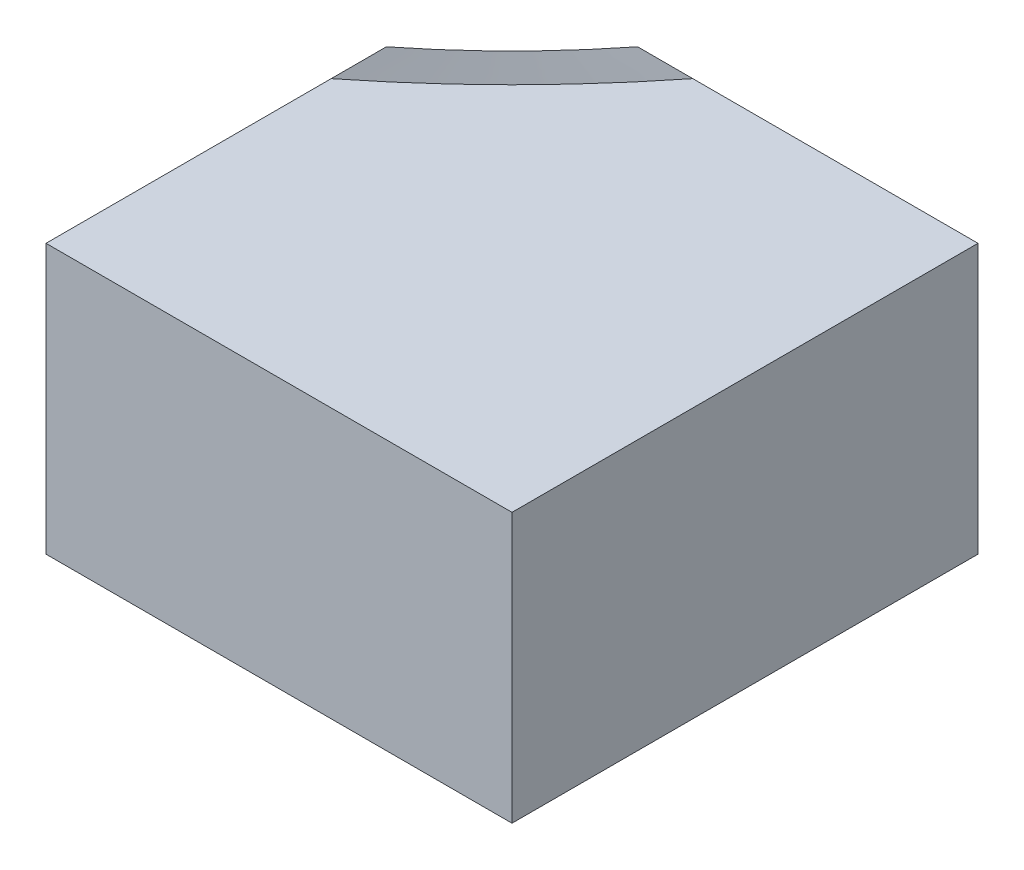
ISO-10303-21;
HEADER;
FILE_DESCRIPTION(('STEP AP214'),'2;1');
FILE_NAME('part.step','',(''),(''),'','','');
FILE_SCHEMA(('AUTOMOTIVE_DESIGN { 1 0 10303 214 1 1 1 1 }'));
ENDSEC;
DATA;
#1=APPLICATION_CONTEXT('core data for automotive mechanical design processes');
#2=APPLICATION_PROTOCOL_DEFINITION('international standard','automotive_design',2000,#1);
#3=PRODUCT_CONTEXT('',#1,'mechanical');
#4=PRODUCT('Part','Part','',(#3));
#5=PRODUCT_RELATED_PRODUCT_CATEGORY('part','',(#4));
#6=PRODUCT_DEFINITION_FORMATION('','',#4);
#7=PRODUCT_DEFINITION_CONTEXT('part definition',#1,'design');
#8=PRODUCT_DEFINITION('design','',#6,#7);
#9=PRODUCT_DEFINITION_SHAPE('','',#8);
#10=(LENGTH_UNIT() NAMED_UNIT(*) SI_UNIT(.MILLI.,.METRE.));
#11=(NAMED_UNIT(*) PLANE_ANGLE_UNIT() SI_UNIT($,.RADIAN.));
#12=(NAMED_UNIT(*) SI_UNIT($,.STERADIAN.) SOLID_ANGLE_UNIT());
#13=UNCERTAINTY_MEASURE_WITH_UNIT(LENGTH_MEASURE(1.E-05),#10,'distance_accuracy_value','');
#14=(GEOMETRIC_REPRESENTATION_CONTEXT(3) GLOBAL_UNCERTAINTY_ASSIGNED_CONTEXT((#13)) GLOBAL_UNIT_ASSIGNED_CONTEXT((#10,
#11,#12)) REPRESENTATION_CONTEXT('',''));
#15=CARTESIAN_POINT('',(0.,0.,0.));
#16=DIRECTION('',(0.,0.,1.));
#17=DIRECTION('',(1.,0.,0.));
#18=AXIS2_PLACEMENT_3D('',#15,#16,#17);
#19=CARTESIAN_POINT('',(32.4999999999999,19.5000000000001,0.));
#20=DIRECTION('',(0.,-1.,0.));
#21=DIRECTION('',(0.,0.,-1.));
#22=AXIS2_PLACEMENT_3D('',#19,#20,#21);
#23=PLANE('',#22);
#24=DIRECTION('',(0.,0.,-1.));
#25=VECTOR('',#24,1.);
#26=CARTESIAN_POINT('',(33.,19.5000000000001,-33.));
#27=LINE('',#26,#25);
#28=CARTESIAN_POINT('',(33.,19.5000000000001,33.));
#29=VERTEX_POINT('',#28);
#30=CARTESIAN_POINT('',(33.,19.5,19.5000000000001));
#31=VERTEX_POINT('',#30);
#32=EDGE_CURVE('E185',#29,#31,#27,.T.);
#33=ORIENTED_EDGE('',*,*,#32,.T.);
#34=DIRECTION('',(1.,0.,0.));
#35=VECTOR('',#34,1.);
#36=CARTESIAN_POINT('',(32.4999999999999,19.5000000000001,19.5000000000001));
#37=LINE('',#36,#35);
#38=CARTESIAN_POINT('',(24.7386337537058,19.5,19.5000000000001));
#39=VERTEX_POINT('',#38);
#40=EDGE_CURVE('E96',#39,#31,#37,.T.);
#41=ORIENTED_EDGE('',*,*,#40,.F.);
#42=CARTESIAN_POINT('',(0.,19.5,0.));
#43=DIRECTION('',(0.,-1.,0.));
#44=DIRECTION('',(0.,0.,-1.));
#45=AXIS2_PLACEMENT_3D('',#42,#43,#44);
#46=CIRCLE('',#45,31.4999999999999);
#47=CARTESIAN_POINT('',(19.5,19.5,24.7386337537059));
#48=VERTEX_POINT('',#47);
#49=EDGE_CURVE('E45',#39,#48,#46,.T.);
#50=ORIENTED_EDGE('',*,*,#49,.T.);
#51=DIRECTION('',(0.,0.,-1.));
#52=VECTOR('',#51,1.);
#53=CARTESIAN_POINT('',(19.5,19.5000000000001,0.));
#54=LINE('',#53,#52);
#55=CARTESIAN_POINT('',(19.5,19.5000000000001,33.));
#56=VERTEX_POINT('',#55);
#57=EDGE_CURVE('E254',#56,#48,#54,.T.);
#58=ORIENTED_EDGE('',*,*,#57,.F.);
#59=DIRECTION('',(-1.,0.,0.));
#60=VECTOR('',#59,1.);
#61=CARTESIAN_POINT('',(0.,19.5000000000001,33.));
#62=LINE('',#61,#60);
#63=EDGE_CURVE('E189',#29,#56,#62,.T.);
#64=ORIENTED_EDGE('',*,*,#63,.F.);
#65=EDGE_LOOP('',(#33,#41,#50,#58,#64));
#66=FACE_BOUND('',#65,.T.);
#67=ADVANCED_FACE('F41',(#66),#23,.F.);
#68=CARTESIAN_POINT('',(0.,13.5486364278669,0.));
#69=DIRECTION('',(0.,1.,0.));
#70=DIRECTION('',(0.,0.,1.));
#71=AXIS2_PLACEMENT_3D('',#68,#69,#70);
#72=CONICAL_SURFACE('',#71,21.8862588450156,1.01648883059334);
#73=ORIENTED_EDGE('',*,*,#49,.F.);
#74=DIRECTION('',(0.667758668490539,0.526354614616297,0.526354614616299));
#75=VECTOR('',#74,1.);
#76=CARTESIAN_POINT('',(0.,0.,0.));
#77=LINE('',#76,#75);
#78=CARTESIAN_POINT('',(17.188448946211,13.5486364278669,13.5486364278669));
#79=VERTEX_POINT('',#78);
#80=EDGE_CURVE('E91',#79,#39,#77,.T.);
#81=ORIENTED_EDGE('',*,*,#80,.F.);
#82=CARTESIAN_POINT('',(0.,13.5486364278669,0.));
#83=DIRECTION('',(0.,-1.,0.));
#84=DIRECTION('',(0.,0.,-1.));
#85=AXIS2_PLACEMENT_3D('',#82,#83,#84);
#86=CIRCLE('',#85,21.8862588450156);
#87=CARTESIAN_POINT('',(13.5486364278668,13.5486364278669,17.188448946211));
#88=VERTEX_POINT('',#87);
#89=EDGE_CURVE('E300',#79,#88,#86,.T.);
#90=ORIENTED_EDGE('',*,*,#89,.T.);
#91=DIRECTION('',(0.526354614616295,0.526354614616297,0.667758668490542));
#92=VECTOR('',#91,1.);
#93=CARTESIAN_POINT('',(0.,0.,0.));
#94=LINE('',#93,#92);
#95=EDGE_CURVE('E60',#48,#88,#94,.F.);
#96=ORIENTED_EDGE('',*,*,#95,.F.);
#97=EDGE_LOOP('',(#73,#81,#90,#96));
#98=FACE_BOUND('',#97,.T.);
#99=ADVANCED_FACE('F174',(#98),#72,.F.);
#100=CARTESIAN_POINT('',(0.,0.,0.));
#101=DIRECTION('',(0.,-1.,0.));
#102=DIRECTION('',(1.,0.,0.));
#103=AXIS2_PLACEMENT_3D('',#100,#101,#102);
#104=SPHERICAL_SURFACE('',#103,25.7405103928719);
#105=ORIENTED_EDGE('',*,*,#89,.F.);
#106=CARTESIAN_POINT('',(0.,0.,13.5486364278669));
#107=DIRECTION('',(0.,0.,-1.));
#108=DIRECTION('',(0.,1.,0.));
#109=AXIS2_PLACEMENT_3D('',#106,#107,#108);
#110=CIRCLE('',#109,21.8862588450156);
#111=CARTESIAN_POINT('',(21.7586001723716,2.36043317420627,13.5486364278669));
#112=VERTEX_POINT('',#111);
#113=EDGE_CURVE('E106',#79,#112,#110,.T.);
#114=ORIENTED_EDGE('',*,*,#113,.T.);
#115=CARTESIAN_POINT('',(0.,2.36043317420627,0.));
#116=DIRECTION('',(0.,-1.,0.));
#117=DIRECTION('',(0.,0.,-1.));
#118=AXIS2_PLACEMENT_3D('',#115,#116,#117);
#119=CIRCLE('',#118,25.6320547462674);
#120=CARTESIAN_POINT('',(13.5486364278669,2.36043317420627,21.7586001723716));
#121=VERTEX_POINT('',#120);
#122=EDGE_CURVE('E146',#112,#121,#119,.T.);
#123=ORIENTED_EDGE('',*,*,#122,.T.);
#124=CARTESIAN_POINT('',(13.5486364278669,0.,0.));
#125=DIRECTION('',(1.,0.,0.));
#126=DIRECTION('',(0.,0.,-1.));
#127=AXIS2_PLACEMENT_3D('',#124,#125,#126);
#128=CIRCLE('',#127,21.8862588450156);
#129=EDGE_CURVE('E258',#88,#121,#128,.T.);
#130=ORIENTED_EDGE('',*,*,#129,.F.);
#131=EDGE_LOOP('',(#105,#114,#123,#130));
#132=FACE_BOUND('',#131,.T.);
#133=ADVANCED_FACE('F155',(#132),#104,.F.);
#134=CARTESIAN_POINT('',(27.6399036193533,2.36043317420627,0.));
#135=DIRECTION('',(0.,-1.,0.));
#136=DIRECTION('',(0.,0.,-1.));
#137=AXIS2_PLACEMENT_3D('',#134,#135,#136);
#138=PLANE('',#137);
#139=CARTESIAN_POINT('',(0.,2.36043317420627,0.));
#140=DIRECTION('',(0.,-1.,0.));
#141=DIRECTION('',(0.,0.,-1.));
#142=AXIS2_PLACEMENT_3D('',#139,#140,#141);
#143=CIRCLE('',#142,27.6399036193533);
#144=CARTESIAN_POINT('',(23.4683824983538,2.36043317420627,14.6013456570995));
#145=VERTEX_POINT('',#144);
#146=CARTESIAN_POINT('',(14.6013456570994,2.36043317420627,23.4683824983539));
#147=VERTEX_POINT('',#146);
#148=EDGE_CURVE('E203',#145,#147,#143,.T.);
#149=ORIENTED_EDGE('',*,*,#148,.T.);
#150=CARTESIAN_POINT('',(24.5993379804337,2.36043317420627,39.6672243534467));
#151=CARTESIAN_POINT('',(23.7135950293793,2.36043317420627,38.2338527694047));
#152=CARTESIAN_POINT('',(22.8279537319469,2.36043317420627,36.8004183129105));
#153=CARTESIAN_POINT('',(21.0570270708889,2.36043317420627,33.9333410794372));
#154=CARTESIAN_POINT('',(20.1717417052222,2.36043317420627,32.4996983037187));
#155=CARTESIAN_POINT('',(18.4016864972902,2.36043317420627,29.6321331625707));
#156=CARTESIAN_POINT('',(17.5169166453003,2.36043317420627,28.1982108031442));
#157=CARTESIAN_POINT('',(15.7481433348418,2.36043317420627,25.3298820901043));
#158=CARTESIAN_POINT('',(14.8641398807546,2.36043317420627,23.8954757337882));
#159=CARTESIAN_POINT('',(13.5391009545038,2.36043317420627,21.7432329454314));
#160=CARTESIAN_POINT('',(13.097573813547,2.36043317420627,21.0256992382864));
#161=CARTESIAN_POINT('',(12.2149691447458,2.36043317420627,19.5903568905841));
#162=CARTESIAN_POINT('',(11.7738916161883,2.36043317420627,18.8725482504653));
#163=CARTESIAN_POINT('',(10.8923655493752,2.36043317420627,17.4365603833588));
#164=CARTESIAN_POINT('',(10.4519170012715,2.36043317420627,16.7183811624184));
#165=CARTESIAN_POINT('',(9.57192167167061,2.36043317420627,15.2814647080534));
#166=CARTESIAN_POINT('',(9.13237489535332,2.36043317420627,14.5627274714561));
#167=CARTESIAN_POINT('',(8.25462626435377,2.36043317420627,13.1243780284814));
#168=CARTESIAN_POINT('',(7.81642448362479,2.36043317420627,12.4047657769252));
#169=CARTESIAN_POINT('',(7.16082863751445,2.36043317420627,11.324320116887));
#170=CARTESIAN_POINT('',(6.94258306131177,2.36043317420627,10.9640035061726));
#171=CARTESIAN_POINT('',(6.50685386593697,2.36043317420627,10.2429077123471));
#172=CARTESIAN_POINT('',(6.28937024968975,2.36043317420627,9.88212852746746));
#173=CARTESIAN_POINT('',(5.85542639213522,2.36043317420627,9.15992114659262));
#174=CARTESIAN_POINT('',(5.63896622231247,2.36043317420627,8.79849290762643));
#175=CARTESIAN_POINT('',(5.20750945525894,2.36043317420627,8.07476758220636));
#176=CARTESIAN_POINT('',(4.99251284256307,2.36043317420627,7.71247050498816));
#177=CARTESIAN_POINT('',(4.67163972631961,2.36043317420627,7.16805323406913));
#178=CARTESIAN_POINT('',(4.56494895683102,2.36043317420627,6.9864130804957));
#179=CARTESIAN_POINT('',(4.35224866349939,2.36043317420627,6.62273508813042));
#180=CARTESIAN_POINT('',(4.24623913705494,2.36043317420627,6.44069725086074));
#181=CARTESIAN_POINT('',(4.0350665234058,2.36043317420627,6.07612184439681));
#182=CARTESIAN_POINT('',(3.92990346663647,2.36043317420627,5.89358425754721));
#183=CARTESIAN_POINT('',(3.72068878746636,2.36043317420627,5.52787040737645));
#184=CARTESIAN_POINT('',(3.61663717976186,2.36043317420627,5.34469413565259));
#185=CARTESIAN_POINT('',(3.51327326796035,2.36043317420627,5.1611282121176));
#186=B_SPLINE_CURVE_WITH_KNOTS('',3,(#150,#151,#152,#153,#154,#155,#156,#157,#158,#159,#160,
#161,#162,#163,#164,#165,#166,#167,#168,#169,#170,#171,#172,#173,#174,#175,#176,#177,#178,#179,
#180,#181,#182,#183,#184,#185),.UNSPECIFIED.,.F.,.F.,(4,2,2,2,2,2,2,2,2,2,2,2,2,2,2,2,2,4),(0.,
5.05488405272402,10.109738694061,15.1644946772692,20.2192793700094,22.7467696141236,
25.2742558429551,27.8017020545297,30.3291627437276,32.8567599989275,34.1205365165781,
35.384317880162,36.6481862482286,37.9120412404829,38.5440089019537,39.1759741487419,
39.8079620176437,40.4399582327647),.UNSPECIFIED.);
#187=EDGE_CURVE('E228',#147,#121,#186,.T.);
#188=ORIENTED_EDGE('',*,*,#187,.T.);
#189=ORIENTED_EDGE('',*,*,#122,.F.);
#190=CARTESIAN_POINT('',(10.8357215029913,2.36043317420627,6.86513776470053));
#191=CARTESIAN_POINT('',(11.2630925597176,2.36043317420627,7.12366176808169));
#192=CARTESIAN_POINT('',(11.6901776505371,2.36043317420627,7.38265757852894));
#193=CARTESIAN_POINT('',(12.5438979374666,2.36043317420627,7.90138867208216));
#194=CARTESIAN_POINT('',(12.970533134086,2.36043317420627,8.16112395434987));
#195=CARTESIAN_POINT('',(13.8234754515046,2.36043317420627,8.6811297137011));
#196=CARTESIAN_POINT('',(14.2497825732131,2.36043317420627,8.94140018929398));
#197=CARTESIAN_POINT('',(15.1021429610876,2.36043317420627,9.46235675172611));
#198=CARTESIAN_POINT('',(15.5281962271704,2.36043317420627,9.72304283870147));
#199=CARTESIAN_POINT('',(16.8060588971724,2.36043317420627,10.505579081987));
#200=CARTESIAN_POINT('',(17.6575743701329,2.36043317420627,11.0279091720098));
#201=CARTESIAN_POINT('',(19.360100704316,2.36043317420627,12.0733923954325));
#202=CARTESIAN_POINT('',(20.2111115650924,2.36043317420627,12.5965455295588));
#203=CARTESIAN_POINT('',(22.6408785628903,2.36043317420627,14.0913192450879));
#204=CARTESIAN_POINT('',(24.2192179304129,2.36043317420627,15.0636172109287));
#205=CARTESIAN_POINT('',(27.3752603205835,2.36043317420627,17.0092439052066));
#206=CARTESIAN_POINT('',(28.9529633434066,2.36043317420627,17.9825726333597));
#207=CARTESIAN_POINT('',(32.107987127397,2.36043317420627,19.9298678577189));
#208=CARTESIAN_POINT('',(33.685307886522,2.36043317420627,20.9038343572336));
#209=CARTESIAN_POINT('',(36.8396840067684,2.36043317420627,22.8521971478645));
#210=CARTESIAN_POINT('',(38.4167393678827,2.36043317420627,23.8265934389923));
#211=CARTESIAN_POINT('',(39.9937245464798,2.36043317420627,24.8011031541808));
#212=B_SPLINE_CURVE_WITH_KNOTS('',3,(#190,#191,#192,#193,#194,#195,#196,#197,#198,#199,#200,
#201,#202,#203,#204,#205,#206,#207,#208,#209,#210,#211),.UNSPECIFIED.,.F.,.F.,(4,2,2,2,2,2,2,2,
2,2,4),(0.,1.49844023879212,2.99687877961776,4.49531315259141,5.99374801635271,8.99060650672547,
11.9874676432788,17.5488214503847,23.1101737262181,28.671555086653,34.2329365965412),.UNSPECIFIED.);
#213=EDGE_CURVE('E137',#112,#145,#212,.T.);
#214=ORIENTED_EDGE('',*,*,#213,.T.);
#215=EDGE_LOOP('',(#149,#188,#189,#214));
#216=FACE_BOUND('',#215,.T.);
#217=ADVANCED_FACE('F149',(#216),#138,.T.);
#218=CARTESIAN_POINT('',(0.,0.,0.));
#219=DIRECTION('',(0.,-1.,0.));
#220=DIRECTION('',(1.,0.,0.));
#221=AXIS2_PLACEMENT_3D('',#218,#219,#220);
#222=SPHERICAL_SURFACE('',#221,27.7405103928719);
#223=CARTESIAN_POINT('',(0.,10.3743688599618,0.));
#224=DIRECTION('',(0.,-1.,0.));
#225=DIRECTION('',(0.,0.,-1.));
#226=AXIS2_PLACEMENT_3D('',#223,#224,#225);
#227=CIRCLE('',#226,25.7275802907014);
#228=CARTESIAN_POINT('',(21.1827546040733,10.3743688599618,14.6013456570995));
#229=VERTEX_POINT('',#228);
#230=CARTESIAN_POINT('',(14.6013456570994,10.3743688599618,21.1827546040733));
#231=VERTEX_POINT('',#230);
#232=EDGE_CURVE('E264',#229,#231,#227,.T.);
#233=ORIENTED_EDGE('',*,*,#232,.T.);
#234=CARTESIAN_POINT('',(14.6013456570995,0.,0.));
#235=DIRECTION('',(-1.,0.,0.));
#236=DIRECTION('',(0.,-1.,0.));
#237=AXIS2_PLACEMENT_3D('',#234,#235,#236);
#238=CIRCLE('',#237,23.5867891383913);
#239=EDGE_CURVE('E147',#231,#147,#238,.F.);
#240=ORIENTED_EDGE('',*,*,#239,.T.);
#241=ORIENTED_EDGE('',*,*,#148,.F.);
#242=CARTESIAN_POINT('',(0.,0.,14.6013456570995));
#243=DIRECTION('',(0.,0.,-1.));
#244=DIRECTION('',(0.,1.,0.));
#245=AXIS2_PLACEMENT_3D('',#242,#243,#244);
#246=CIRCLE('',#245,23.5867891383913);
#247=EDGE_CURVE('E204',#145,#229,#246,.F.);
#248=ORIENTED_EDGE('',*,*,#247,.T.);
#249=EDGE_LOOP('',(#233,#240,#241,#248));
#250=FACE_BOUND('',#249,.T.);
#251=ADVANCED_FACE('F154',(#250),#222,.T.);
#252=CARTESIAN_POINT('',(19.4999999999999,32.5,0.));
#253=DIRECTION('',(-1.,0.,0.));
#254=DIRECTION('',(0.,0.,-1.));
#255=AXIS2_PLACEMENT_3D('',#252,#253,#254);
#256=PLANE('',#255);
#257=DIRECTION('',(0.,0.,-1.));
#258=VECTOR('',#257,1.);
#259=CARTESIAN_POINT('',(19.5,11.7000000000001,0.));
#260=LINE('',#259,#258);
#261=CARTESIAN_POINT('',(19.5,11.7,33.));
#262=VERTEX_POINT('',#261);
#263=CARTESIAN_POINT('',(19.5,11.7000000000001,29.2465382566894));
#264=VERTEX_POINT('',#263);
#265=EDGE_CURVE('E114',#262,#264,#260,.T.);
#266=ORIENTED_EDGE('',*,*,#265,.F.);
#267=DIRECTION('',(0.,1.,0.));
#268=VECTOR('',#267,1.);
#269=CARTESIAN_POINT('',(19.5000000000001,0.,33.));
#270=LINE('',#269,#268);
#271=EDGE_CURVE('E194',#262,#56,#270,.T.);
#272=ORIENTED_EDGE('',*,*,#271,.T.);
#273=ORIENTED_EDGE('',*,*,#57,.T.);
#274=CARTESIAN_POINT('',(19.5,0.,0.));
#275=DIRECTION('',(1.,0.,0.));
#276=DIRECTION('',(0.,0.,-1.));
#277=AXIS2_PLACEMENT_3D('',#274,#275,#276);
#278=CIRCLE('',#277,31.4999999999999);
#279=EDGE_CURVE('E11',#48,#264,#278,.T.);
#280=ORIENTED_EDGE('',*,*,#279,.T.);
#281=EDGE_LOOP('',(#266,#272,#273,#280));
#282=FACE_BOUND('',#281,.T.);
#283=ADVANCED_FACE('F159',(#282),#256,.T.);
#284=CARTESIAN_POINT('',(32.5,11.7000000000001,0.));
#285=DIRECTION('',(0.,-1.,0.));
#286=DIRECTION('',(0.,0.,-1.));
#287=AXIS2_PLACEMENT_3D('',#284,#285,#286);
#288=PLANE('',#287);
#289=DIRECTION('',(0.,0.,-1.));
#290=VECTOR('',#289,1.);
#291=CARTESIAN_POINT('',(33.,11.7000000000001,-33.));
#292=LINE('',#291,#290);
#293=CARTESIAN_POINT('',(33.,11.7000000000001,33.));
#294=VERTEX_POINT('',#293);
#295=CARTESIAN_POINT('',(33.,11.7000000000001,19.5000000000001));
#296=VERTEX_POINT('',#295);
#297=EDGE_CURVE('E193',#294,#296,#292,.T.);
#298=ORIENTED_EDGE('',*,*,#297,.F.);
#299=DIRECTION('',(-1.,0.,0.));
#300=VECTOR('',#299,1.);
#301=CARTESIAN_POINT('',(0.,11.7000000000001,33.));
#302=LINE('',#301,#300);
#303=EDGE_CURVE('E226',#294,#262,#302,.T.);
#304=ORIENTED_EDGE('',*,*,#303,.T.);
#305=ORIENTED_EDGE('',*,*,#265,.T.);
#306=CARTESIAN_POINT('',(29.9831042332942,11.7000000000001,46.9998523165172));
#307=CARTESIAN_POINT('',(29.5695460419096,11.7000000000001,46.3114035057555));
#308=CARTESIAN_POINT('',(29.1563727624076,11.7000000000001,45.6227235286328));
#309=CARTESIAN_POINT('',(28.3309145968263,11.7000000000001,44.2448305512274));
#310=CARTESIAN_POINT('',(27.9186297115495,11.7000000000001,43.555617550464));
#311=CARTESIAN_POINT('',(26.6832428349779,11.7000000000001,41.4870015235794));
#312=CARTESIAN_POINT('',(25.8616526236678,11.7000000000001,40.1066946636882));
#313=CARTESIAN_POINT('',(24.2230959746683,11.7000000000001,37.3416252164109));
#314=CARTESIAN_POINT('',(23.4061344741696,11.7000000000001,35.9568597018244));
#315=CARTESIAN_POINT('',(21.7796223492399,11.7000000000001,33.1830492762636));
#316=CARTESIAN_POINT('',(20.970071426122,11.7000000000001,31.7940045408084));
#317=CARTESIAN_POINT('',(19.7705932500849,11.7000000000001,29.7178208854183));
#318=CARTESIAN_POINT('',(19.3766538702403,11.7000000000001,29.0330001316483));
#319=CARTESIAN_POINT('',(18.5918894504467,11.7000000000001,27.6615773365093));
#320=CARTESIAN_POINT('',(18.2010644029119,11.7000000000001,26.9749752994846));
#321=CARTESIAN_POINT('',(17.423168342795,11.7000000000001,25.5995290510725));
#322=CARTESIAN_POINT('',(17.036097821589,11.7000000000001,24.9106845615479));
#323=CARTESIAN_POINT('',(16.2666803040386,11.7000000000001,23.5303641361797));
#324=CARTESIAN_POINT('',(15.8843332831974,11.7000000000001,22.8388882140075));
#325=CARTESIAN_POINT('',(15.1254733333848,11.7000000000001,21.4524772962229));
#326=CARTESIAN_POINT('',(14.7489621260672,11.7000000000001,20.7575413568386));
#327=CARTESIAN_POINT('',(14.0035422153921,11.7000000000001,19.3635718196275));
#328=CARTESIAN_POINT('',(13.6346337030667,11.7000000000001,18.6645381194022));
#329=CARTESIAN_POINT('',(12.9068241377435,11.7000000000001,17.2614510623169));
#330=CARTESIAN_POINT('',(12.5479210327491,11.7000000000001,16.5573987724639));
#331=CARTESIAN_POINT('',(11.8433270003428,11.7000000000001,15.1427313714644));
#332=CARTESIAN_POINT('',(11.497635196273,11.7000000000001,14.4321166996746));
#333=CARTESIAN_POINT('',(10.9364574878759,11.7000000000001,13.240600979307));
#334=CARTESIAN_POINT('',(10.7159690889732,11.7000000000001,12.7620597933423));
#335=CARTESIAN_POINT('',(10.2849806158187,11.7000000000001,11.8004978032896));
#336=CARTESIAN_POINT('',(10.0744802539218,11.7000000000001,11.3174771286857));
#337=CARTESIAN_POINT('',(9.66645541430141,11.7000000000001,10.3472711456755));
#338=CARTESIAN_POINT('',(9.4689021222929,11.7000000000001,9.86009801543928));
#339=CARTESIAN_POINT('',(9.08946560082895,11.7000000000001,8.87955373046023));
#340=CARTESIAN_POINT('',(8.90758483272758,11.7000000000001,8.3861816160635));
#341=CARTESIAN_POINT('',(8.5624843162843,11.7000000000001,7.38905623057931));
#342=CARTESIAN_POINT('',(8.39940314340287,11.7000000000001,6.88525462559466));
#343=CARTESIAN_POINT('',(8.09868484115985,11.7000000000001,5.87024913974239));
#344=CARTESIAN_POINT('',(7.96103480095306,11.7000000000001,5.35904915780938));
#345=CARTESIAN_POINT('',(7.77767829893197,11.7000000000001,4.58476199325067));
#346=CARTESIAN_POINT('',(7.720241995675,11.7000000000001,4.32443264170045));
#347=CARTESIAN_POINT('',(7.61414186909903,11.7000000000001,3.80199727296307));
#348=CARTESIAN_POINT('',(7.5654774514676,11.7000000000001,3.53989137738966));
#349=CARTESIAN_POINT('',(7.47762859472269,11.7000000000001,3.01369854516661));
#350=CARTESIAN_POINT('',(7.43845788058526,11.7000000000001,2.74960930277732));
#351=CARTESIAN_POINT('',(7.37033995165896,11.7000000000001,2.22004865762173));
#352=CARTESIAN_POINT('',(7.34139544112448,11.7000000000001,1.95457690806531));
#353=CARTESIAN_POINT('',(7.31790114012981,11.7000000000001,1.68859662969376));
#354=B_SPLINE_CURVE_WITH_KNOTS('',3,(#306,#307,#308,#309,#310,#311,#312,#313,#314,#315,#316,
#317,#318,#319,#320,#321,#322,#323,#324,#325,#326,#327,#328,#329,#330,#331,#332,#333,#334,#335,
#336,#337,#338,#339,#340,#341,#342,#343,#344,#345,#346,#347,#348,#349,#350,#351,#352,#353),
.UNSPECIFIED.,.F.,.F.,(4,2,2,2,2,2,2,2,2,2,2,2,2,2,2,2,2,2,2,2,2,2,2,4),(0.,2.40934177011957,
4.81868571602445,9.63762980352724,14.4609978331241,19.2841705909017,21.6542928680232,
24.0244093702654,26.3948319875908,28.7652423064302,31.1363391094846,33.5074954184083,
35.8781617978656,38.2486705936817,39.8292635557093,41.4098109706272,42.9867121606657,
44.5638605517928,46.1519772751732,47.7392855165716,48.5389310863669,49.3385224582279,
50.1392629888806,50.9402151120507),.UNSPECIFIED.);
#355=CARTESIAN_POINT('',(17.6869248733467,11.7000000000001,26.0657378281258));
#356=VERTEX_POINT('',#355);
#357=EDGE_CURVE('E112',#264,#356,#354,.T.);
#358=ORIENTED_EDGE('',*,*,#357,.T.);
#359=CARTESIAN_POINT('',(0.,11.7000000000001,0.));
#360=DIRECTION('',(0.,-1.,0.));
#361=DIRECTION('',(0.,0.,-1.));
#362=AXIS2_PLACEMENT_3D('',#359,#360,#361);
#363=CIRCLE('',#362,31.5);
#364=CARTESIAN_POINT('',(26.0657378281258,11.7000000000001,17.6869248733468));
#365=VERTEX_POINT('',#364);
#366=EDGE_CURVE('E105',#365,#356,#363,.T.);
#367=ORIENTED_EDGE('',*,*,#366,.F.);
#368=CARTESIAN_POINT('',(1.68859662969362,11.7000000000001,7.31790114012991));
#369=CARTESIAN_POINT('',(1.87252860197762,11.7000000000001,7.33416074384991));
#370=CARTESIAN_POINT('',(2.05621891841642,11.7000000000001,7.35301284788605));
#371=CARTESIAN_POINT('',(2.42300448044872,11.7000000000001,7.39570336053311));
#372=CARTESIAN_POINT('',(2.60609977454128,11.7000000000001,7.41954135184829));
#373=CARTESIAN_POINT('',(3.15409688077382,11.7000000000001,7.49820148135874));
#374=CARTESIAN_POINT('',(3.51798669240142,11.7000000000001,7.56019481451234));
#375=CARTESIAN_POINT('',(4.24069608301457,11.7000000000001,7.7010197528768));
#376=CARTESIAN_POINT('',(4.59953131930248,11.7000000000001,7.7797722437193));
#377=CARTESIAN_POINT('',(5.3136431449388,11.7000000000001,7.9522122858681));
#378=CARTESIAN_POINT('',(5.66891905551187,11.7000000000001,8.04590263034534));
#379=CARTESIAN_POINT('',(6.37386719991572,11.7000000000001,8.24562306564878));
#380=CARTESIAN_POINT('',(6.72355942660548,11.7000000000001,8.35158308028888));
#381=CARTESIAN_POINT('',(7.4194166914267,11.7000000000001,8.57440344235992));
#382=CARTESIAN_POINT('',(7.765581891746,11.7000000000001,8.69126328603763));
#383=CARTESIAN_POINT('',(8.45509021413745,11.7000000000001,8.93442814934845));
#384=CARTESIAN_POINT('',(8.79842892377862,11.7000000000001,9.06074563825807));
#385=CARTESIAN_POINT('',(9.31115756218885,11.7000000000001,9.25614984584988));
#386=CARTESIAN_POINT('',(9.48168594069194,11.7000000000001,9.32227206217789));
#387=CARTESIAN_POINT('',(9.82202271662351,11.7000000000001,9.45634301137272));
#388=CARTESIAN_POINT('',(9.99183111630944,11.7000000000001,9.52429173850769));
#389=CARTESIAN_POINT('',(10.5619495090641,11.7000000000001,9.75571075274405));
#390=CARTESIAN_POINT('',(10.9606971840296,11.7000000000001,9.92303919520667));
#391=CARTESIAN_POINT('',(11.754849363323,11.7000000000001,10.2654699905591));
#392=CARTESIAN_POINT('',(12.150253680094,11.7000000000001,10.4405727761773));
#393=CARTESIAN_POINT('',(12.9382037530064,11.7000000000001,10.7972783679184));
#394=CARTESIAN_POINT('',(13.3307489558271,11.7000000000001,10.9788823939984));
#395=CARTESIAN_POINT('',(14.1132915297817,11.7000000000001,11.34750882738));
#396=CARTESIAN_POINT('',(14.5032888462196,11.7000000000001,11.5345313505367));
#397=CARTESIAN_POINT('',(15.2813567071964,11.7000000000001,11.913282258743));
#398=CARTESIAN_POINT('',(15.6694255535406,11.7000000000001,12.10501412728));
#399=CARTESIAN_POINT('',(16.443623847318,11.7000000000001,12.4923578434095));
#400=CARTESIAN_POINT('',(16.829753274669,11.7000000000001,12.687969731075));
#401=CARTESIAN_POINT('',(17.9855231881893,11.7000000000001,13.2797013350639));
#402=CARTESIAN_POINT('',(18.752635075581,11.7000000000001,13.6807610322329));
#403=CARTESIAN_POINT('',(20.2835257304401,11.7000000000001,14.4936042551411));
#404=CARTESIAN_POINT('',(21.0472918531971,11.7000000000001,14.9054114908331));
#405=CARTESIAN_POINT('',(22.5707726899078,11.7000000000001,15.736479888048));
#406=CARTESIAN_POINT('',(23.3304873190307,11.7000000000001,16.1557412048553));
#407=CARTESIAN_POINT('',(24.8463519872949,11.7000000000001,16.9998381066429));
#408=CARTESIAN_POINT('',(25.6025035011843,11.7000000000001,17.424671047491));
#409=CARTESIAN_POINT('',(27.1122242804787,11.7000000000001,18.2788837448426));
#410=CARTESIAN_POINT('',(27.8657935641776,11.7000000000001,18.7082634690459));
#411=CARTESIAN_POINT('',(29.3920564325115,11.7000000000001,19.5828284218626));
#412=CARTESIAN_POINT('',(30.1646902008871,11.7000000000001,20.0281179586167));
#413=CARTESIAN_POINT('',(31.708151818901,11.7000000000001,20.9218169061321));
#414=CARTESIAN_POINT('',(32.4789796655186,11.7000000000001,21.3702263221071));
#415=CARTESIAN_POINT('',(34.0192530824412,11.7000000000001,22.2696670117186));
#416=CARTESIAN_POINT('',(34.7886984365306,11.7000000000001,22.7206986554432));
#417=CARTESIAN_POINT('',(36.326341896421,11.7000000000001,23.6248832057995));
#418=CARTESIAN_POINT('',(37.094540001504,11.7000000000001,24.078036113652));
#419=CARTESIAN_POINT('',(38.6254534054425,11.7000000000001,24.9834986793613));
#420=CARTESIAN_POINT('',(39.3881747571644,11.7000000000001,25.4357981064243));
#421=CARTESIAN_POINT('',(40.9127329092829,11.7000000000001,26.3418856820324));
#422=CARTESIAN_POINT('',(41.6745697093054,11.7000000000001,26.7956738312069));
#423=CARTESIAN_POINT('',(43.1973567222083,11.7000000000001,27.7044428425147));
#424=CARTESIAN_POINT('',(43.9583070632214,11.7000000000001,28.159423489994));
#425=CARTESIAN_POINT('',(45.4795487528973,11.7000000000001,29.0704828047002));
#426=CARTESIAN_POINT('',(46.2398401024849,11.7000000000001,29.5265614703827));
#427=CARTESIAN_POINT('',(46.9998523165173,11.7000000000001,29.9831042332943));
#428=B_SPLINE_CURVE_WITH_KNOTS('',3,(#368,#369,#370,#371,#372,#373,#374,#375,#376,#377,#378,
#379,#380,#381,#382,#383,#384,#385,#386,#387,#388,#389,#390,#391,#392,#393,#394,#395,#396,#397,
#398,#399,#400,#401,#402,#403,#404,#405,#406,#407,#408,#409,#410,#411,#412,#413,#414,#415,#416,
#417,#418,#419,#420,#421,#422,#423,#424,#425,#426,#427),.UNSPECIFIED.,.F.,.F.,(4,2,2,2,2,2,2,2,
2,2,2,2,2,2,2,2,2,2,2,2,2,2,2,2,2,2,2,2,2,4),(0.,0.553907529583437,1.10776871820341,
2.21465846164015,3.31643447993413,4.41841675716005,5.51438978916932,6.61031219408693,
7.70770584423091,8.25639448518369,8.80508140447518,10.1022683738116,11.3995276367078,
12.6970316194598,13.9945633651469,15.2930856540243,16.5916213610612,19.1883928480791,
21.7914801922247,24.394621827912,26.9965698391017,29.5984993784052,32.2737869779754,
34.9490790493939,37.6247583366482,40.3004391639493,42.9606754751118,45.6209129109449,
48.2807005198646,50.9404843901035),.UNSPECIFIED.);
#429=CARTESIAN_POINT('',(29.2465382566893,11.7000000000001,19.5000000000001));
#430=VERTEX_POINT('',#429);
#431=EDGE_CURVE('E86',#365,#430,#428,.T.);
#432=ORIENTED_EDGE('',*,*,#431,.T.);
#433=DIRECTION('',(1.,0.,0.));
#434=VECTOR('',#433,1.);
#435=CARTESIAN_POINT('',(32.5,11.7000000000001,19.5000000000001));
#436=LINE('',#435,#434);
#437=EDGE_CURVE('E103',#430,#296,#436,.T.);
#438=ORIENTED_EDGE('',*,*,#437,.T.);
#439=EDGE_LOOP('',(#298,#304,#305,#358,#367,#432,#438));
#440=FACE_BOUND('',#439,.T.);
#441=ADVANCED_FACE('F101',(#440),#288,.T.);
#442=CARTESIAN_POINT('',(13.5486364278669,0.,0.));
#443=DIRECTION('',(1.,0.,0.));
#444=DIRECTION('',(0.,0.,1.));
#445=AXIS2_PLACEMENT_3D('',#442,#443,#444);
#446=CONICAL_SURFACE('',#445,21.8862588450156,1.01648883059334);
#447=ORIENTED_EDGE('',*,*,#239,.F.);
#448=DIRECTION('',(0.526354614616296,0.373979018880187,0.763603636129074));
#449=VECTOR('',#448,1.);
#450=CARTESIAN_POINT('',(0.,0.,0.));
#451=LINE('',#450,#449);
#452=CARTESIAN_POINT('',(17.6869248733467,12.5666967239637,25.6591274592982));
#453=VERTEX_POINT('',#452);
#454=EDGE_CURVE('E206',#453,#231,#451,.F.);
#455=ORIENTED_EDGE('',*,*,#454,.F.);
#456=CARTESIAN_POINT('',(17.6869248733468,0.,0.));
#457=DIRECTION('',(-1.,0.,0.));
#458=DIRECTION('',(0.,-1.,0.));
#459=AXIS2_PLACEMENT_3D('',#456,#457,#458);
#460=CIRCLE('',#459,28.5711863338677);
#461=EDGE_CURVE('E209',#356,#453,#460,.T.);
#462=ORIENTED_EDGE('',*,*,#461,.F.);
#463=ORIENTED_EDGE('',*,*,#357,.F.);
#464=ORIENTED_EDGE('',*,*,#279,.F.);
#465=ORIENTED_EDGE('',*,*,#95,.T.);
#466=ORIENTED_EDGE('',*,*,#129,.T.);
#467=ORIENTED_EDGE('',*,*,#187,.F.);
#468=EDGE_LOOP('',(#447,#455,#462,#463,#464,#465,#466,#467));
#469=FACE_BOUND('',#468,.T.);
#470=ADVANCED_FACE('F133',(#469),#446,.T.);
#471=CARTESIAN_POINT('',(0.,0.,0.));
#472=DIRECTION('',(0.,-1.,0.));
#473=DIRECTION('',(1.,0.,0.));
#474=AXIS2_PLACEMENT_3D('',#471,#472,#473);
#475=SPHERICAL_SURFACE('',#474,33.6026784646701);
#476=ORIENTED_EDGE('',*,*,#366,.T.);
#477=ORIENTED_EDGE('',*,*,#461,.T.);
#478=CARTESIAN_POINT('',(0.,12.5666967239637,0.));
#479=DIRECTION('',(0.,-1.,0.));
#480=DIRECTION('',(0.,0.,-1.));
#481=AXIS2_PLACEMENT_3D('',#478,#479,#480);
#482=CIRCLE('',#481,31.1643728229516);
#483=CARTESIAN_POINT('',(25.6591274592981,12.5666967239637,17.6869248733468));
#484=VERTEX_POINT('',#483);
#485=EDGE_CURVE('E260',#484,#453,#482,.T.);
#486=ORIENTED_EDGE('',*,*,#485,.F.);
#487=CARTESIAN_POINT('',(0.,0.,17.6869248733468));
#488=DIRECTION('',(0.,0.,-1.));
#489=DIRECTION('',(0.,1.,0.));
#490=AXIS2_PLACEMENT_3D('',#487,#488,#489);
#491=CIRCLE('',#490,28.5711863338677);
#492=EDGE_CURVE('E117',#484,#365,#491,.T.);
#493=ORIENTED_EDGE('',*,*,#492,.T.);
#494=EDGE_LOOP('',(#476,#477,#486,#493));
#495=FACE_BOUND('',#494,.T.);
#496=ADVANCED_FACE('F132',(#495),#475,.F.);
#497=CARTESIAN_POINT('',(0.,0.,13.5486364278669));
#498=DIRECTION('',(0.,0.,1.));
#499=DIRECTION('',(0.,-1.,0.));
#500=AXIS2_PLACEMENT_3D('',#497,#498,#499);
#501=CONICAL_SURFACE('',#500,21.8862588450156,1.01648883059334);
#502=ORIENTED_EDGE('',*,*,#247,.F.);
#503=ORIENTED_EDGE('',*,*,#213,.F.);
#504=ORIENTED_EDGE('',*,*,#113,.F.);
#505=ORIENTED_EDGE('',*,*,#80,.T.);
#506=CARTESIAN_POINT('',(0.,0.,19.5));
#507=DIRECTION('',(0.,0.,-1.));
#508=DIRECTION('',(0.,1.,0.));
#509=AXIS2_PLACEMENT_3D('',#506,#507,#508);
#510=CIRCLE('',#509,31.4999999999999);
#511=EDGE_CURVE('E51',#39,#430,#510,.T.);
#512=ORIENTED_EDGE('',*,*,#511,.T.);
#513=ORIENTED_EDGE('',*,*,#431,.F.);
#514=ORIENTED_EDGE('',*,*,#492,.F.);
#515=DIRECTION('',(0.763603636129072,0.373979018880187,0.526354614616298));
#516=VECTOR('',#515,1.);
#517=CARTESIAN_POINT('',(0.,0.,0.));
#518=LINE('',#517,#516);
#519=EDGE_CURVE('E207',#229,#484,#518,.T.);
#520=ORIENTED_EDGE('',*,*,#519,.F.);
#521=EDGE_LOOP('',(#502,#503,#504,#505,#512,#513,#514,#520));
#522=FACE_BOUND('',#521,.T.);
#523=ADVANCED_FACE('F83',(#522),#501,.T.);
#524=CARTESIAN_POINT('',(32.4999999999999,0.,19.5000000000001));
#525=DIRECTION('',(0.,0.,-1.));
#526=DIRECTION('',(0.,1.,0.));
#527=AXIS2_PLACEMENT_3D('',#524,#525,#526);
#528=PLANE('',#527);
#529=DIRECTION('',(0.,1.,0.));
#530=VECTOR('',#529,1.);
#531=CARTESIAN_POINT('',(33.,-33.0000000000002,19.4999999999999));
#532=LINE('',#531,#530);
#533=EDGE_CURVE('E111',#296,#31,#532,.T.);
#534=ORIENTED_EDGE('',*,*,#533,.F.);
#535=ORIENTED_EDGE('',*,*,#437,.F.);
#536=ORIENTED_EDGE('',*,*,#511,.F.);
#537=ORIENTED_EDGE('',*,*,#40,.T.);
#538=EDGE_LOOP('',(#534,#535,#536,#537));
#539=FACE_BOUND('',#538,.T.);
#540=ADVANCED_FACE('F109',(#539),#528,.T.);
#541=CARTESIAN_POINT('',(0.,10.3743688599618,0.));
#542=DIRECTION('',(0.,1.,0.));
#543=DIRECTION('',(0.,0.,1.));
#544=AXIS2_PLACEMENT_3D('',#541,#542,#543);
#545=CONICAL_SURFACE('',#544,25.7275802907014,1.18750065982306);
#546=ORIENTED_EDGE('',*,*,#485,.T.);
#547=ORIENTED_EDGE('',*,*,#454,.T.);
#548=ORIENTED_EDGE('',*,*,#232,.F.);
#549=ORIENTED_EDGE('',*,*,#519,.T.);
#550=EDGE_LOOP('',(#546,#547,#548,#549));
#551=FACE_BOUND('',#550,.T.);
#552=ADVANCED_FACE('F164',(#551),#545,.T.);
#553=CARTESIAN_POINT('',(33.,-33.,-33.));
#554=DIRECTION('',(1.,0.,0.));
#555=DIRECTION('',(0.,0.,-1.));
#556=AXIS2_PLACEMENT_3D('',#553,#554,#555);
#557=PLANE('',#556);
#558=ORIENTED_EDGE('',*,*,#32,.F.);
#559=DIRECTION('',(0.,1.,0.));
#560=VECTOR('',#559,1.);
#561=CARTESIAN_POINT('',(33.,-33.,33.));
#562=LINE('',#561,#560);
#563=EDGE_CURVE('E198',#294,#29,#562,.T.);
#564=ORIENTED_EDGE('',*,*,#563,.F.);
#565=ORIENTED_EDGE('',*,*,#297,.T.);
#566=ORIENTED_EDGE('',*,*,#533,.T.);
#567=EDGE_LOOP('',(#558,#564,#565,#566));
#568=FACE_BOUND('',#567,.T.);
#569=ADVANCED_FACE('F161',(#568),#557,.T.);
#570=CARTESIAN_POINT('',(0.,0.,33.));
#571=DIRECTION('',(0.,0.,-1.));
#572=DIRECTION('',(-1.,0.,0.));
#573=AXIS2_PLACEMENT_3D('',#570,#571,#572);
#574=PLANE('',#573);
#575=ORIENTED_EDGE('',*,*,#271,.F.);
#576=ORIENTED_EDGE('',*,*,#303,.F.);
#577=ORIENTED_EDGE('',*,*,#563,.T.);
#578=ORIENTED_EDGE('',*,*,#63,.T.);
#579=EDGE_LOOP('',(#575,#576,#577,#578));
#580=FACE_BOUND('',#579,.T.);
#581=ADVANCED_FACE('F168',(#580),#574,.F.);
#582=CLOSED_SHELL('',(#67,#99,#133,#217,#251,#283,#441,#470,#496,#523,#540,#552,#569,#581));
#583=MANIFOLD_SOLID_BREP('B2',#582);
#584=ADVANCED_BREP_SHAPE_REPRESENTATION('',(#18,#583),#14);
#585=SHAPE_DEFINITION_REPRESENTATION(#9,#584);
ENDSEC;
END-ISO-10303-21;
